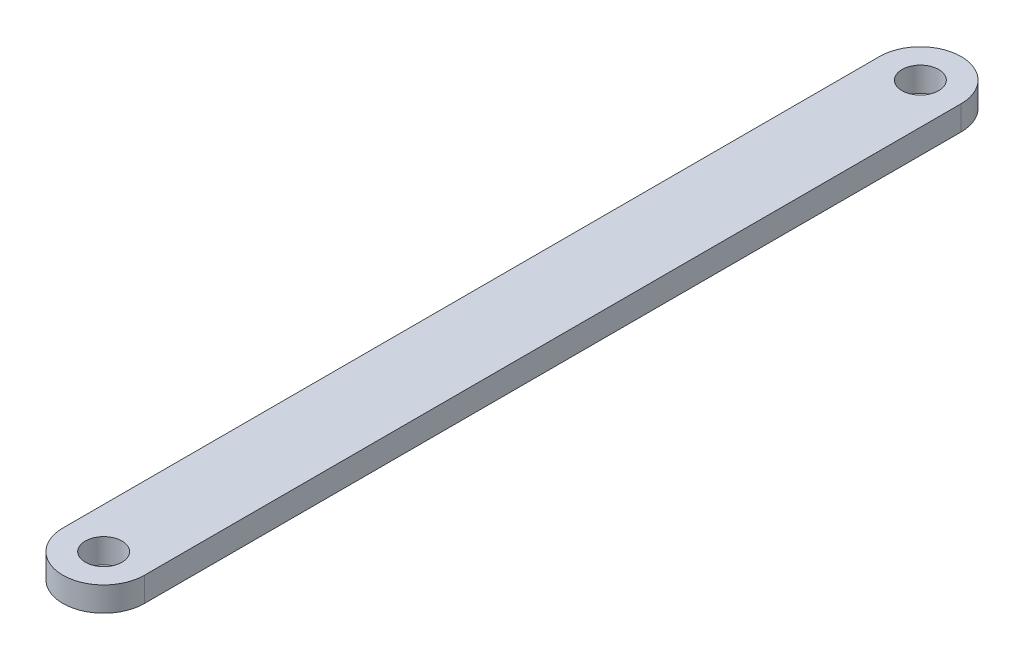
ISO-10303-21;
HEADER;
FILE_DESCRIPTION(('STEP AP214'),'2;1');
FILE_NAME('part.step','',(''),(''),'','','');
FILE_SCHEMA(('AUTOMOTIVE_DESIGN { 1 0 10303 214 1 1 1 1 }'));
ENDSEC;
DATA;
#1=APPLICATION_CONTEXT('core data for automotive mechanical design processes');
#2=APPLICATION_PROTOCOL_DEFINITION('international standard','automotive_design',2000,#1);
#3=PRODUCT_CONTEXT('',#1,'mechanical');
#4=PRODUCT('Part','Part','',(#3));
#5=PRODUCT_RELATED_PRODUCT_CATEGORY('part','',(#4));
#6=PRODUCT_DEFINITION_FORMATION('','',#4);
#7=PRODUCT_DEFINITION_CONTEXT('part definition',#1,'design');
#8=PRODUCT_DEFINITION('design','',#6,#7);
#9=PRODUCT_DEFINITION_SHAPE('','',#8);
#10=(LENGTH_UNIT() NAMED_UNIT(*) SI_UNIT(.MILLI.,.METRE.));
#11=(NAMED_UNIT(*) PLANE_ANGLE_UNIT() SI_UNIT($,.RADIAN.));
#12=(NAMED_UNIT(*) SI_UNIT($,.STERADIAN.) SOLID_ANGLE_UNIT());
#13=UNCERTAINTY_MEASURE_WITH_UNIT(LENGTH_MEASURE(1.E-05),#10,'distance_accuracy_value','');
#14=(GEOMETRIC_REPRESENTATION_CONTEXT(3) GLOBAL_UNCERTAINTY_ASSIGNED_CONTEXT((#13)) GLOBAL_UNIT_ASSIGNED_CONTEXT((#10,
#11,#12)) REPRESENTATION_CONTEXT('',''));
#15=CARTESIAN_POINT('',(0.,0.,0.));
#16=DIRECTION('',(0.,0.,1.));
#17=DIRECTION('',(1.,0.,0.));
#18=AXIS2_PLACEMENT_3D('',#15,#16,#17);
#19=CARTESIAN_POINT('',(0.,3.,0.));
#20=DIRECTION('',(0.,1.,0.));
#21=DIRECTION('',(0.,0.,1.));
#22=AXIS2_PLACEMENT_3D('',#19,#20,#21);
#23=PLANE('',#22);
#24=CARTESIAN_POINT('',(0.,3.,0.));
#25=DIRECTION('',(0.,1.,0.));
#26=DIRECTION('',(0.,0.,1.));
#27=AXIS2_PLACEMENT_3D('',#24,#25,#26);
#28=CIRCLE('',#27,2.25);
#29=CARTESIAN_POINT('',(0.,3.,2.25));
#30=VERTEX_POINT('',#29);
#31=EDGE_CURVE('E100',#30,#30,#28,.T.);
#32=ORIENTED_EDGE('',*,*,#31,.F.);
#33=EDGE_LOOP('',(#32));
#34=FACE_BOUND('',#33,.T.);
#35=CARTESIAN_POINT('',(0.,3.,0.));
#36=DIRECTION('',(0.,1.,0.));
#37=DIRECTION('',(0.,0.,1.));
#38=AXIS2_PLACEMENT_3D('',#35,#36,#37);
#39=CIRCLE('',#38,5.);
#40=CARTESIAN_POINT('',(5.,3.,0.));
#41=VERTEX_POINT('',#40);
#42=CARTESIAN_POINT('',(-5.,3.,0.));
#43=VERTEX_POINT('',#42);
#44=EDGE_CURVE('E85',#41,#43,#39,.T.);
#45=ORIENTED_EDGE('',*,*,#44,.T.);
#46=DIRECTION('',(0.,0.,1.));
#47=VECTOR('',#46,1.);
#48=CARTESIAN_POINT('',(-5.,3.,0.));
#49=LINE('',#48,#47);
#50=CARTESIAN_POINT('',(-4.99999999999999,3.,100.));
#51=VERTEX_POINT('',#50);
#52=EDGE_CURVE('E80',#43,#51,#49,.T.);
#53=ORIENTED_EDGE('',*,*,#52,.T.);
#54=CARTESIAN_POINT('',(0.,3.,100.));
#55=DIRECTION('',(0.,1.,0.));
#56=DIRECTION('',(0.,0.,1.));
#57=AXIS2_PLACEMENT_3D('',#54,#55,#56);
#58=CIRCLE('',#57,5.);
#59=CARTESIAN_POINT('',(5.00000000000001,3.,100.));
#60=VERTEX_POINT('',#59);
#61=EDGE_CURVE('E83',#51,#60,#58,.T.);
#62=ORIENTED_EDGE('',*,*,#61,.T.);
#63=DIRECTION('',(0.,0.,-1.));
#64=VECTOR('',#63,1.);
#65=CARTESIAN_POINT('',(5.,3.,0.));
#66=LINE('',#65,#64);
#67=EDGE_CURVE('E50',#60,#41,#66,.T.);
#68=ORIENTED_EDGE('',*,*,#67,.T.);
#69=EDGE_LOOP('',(#45,#53,#62,#68));
#70=FACE_BOUND('',#69,.T.);
#71=CARTESIAN_POINT('',(0.,3.,100.));
#72=DIRECTION('',(0.,1.,0.));
#73=DIRECTION('',(0.,0.,1.));
#74=AXIS2_PLACEMENT_3D('',#71,#72,#73);
#75=CIRCLE('',#74,2.25);
#76=CARTESIAN_POINT('',(0.,3.,102.25));
#77=VERTEX_POINT('',#76);
#78=EDGE_CURVE('E115',#77,#77,#75,.T.);
#79=ORIENTED_EDGE('',*,*,#78,.F.);
#80=EDGE_LOOP('',(#79));
#81=FACE_BOUND('',#80,.T.);
#82=ADVANCED_FACE('F33',(#34,#70,#81),#23,.T.);
#83=CARTESIAN_POINT('',(0.,0.,0.));
#84=DIRECTION('',(0.,1.,0.));
#85=DIRECTION('',(0.,0.,1.));
#86=AXIS2_PLACEMENT_3D('',#83,#84,#85);
#87=PLANE('',#86);
#88=CARTESIAN_POINT('',(0.,0.,0.));
#89=DIRECTION('',(0.,1.,0.));
#90=DIRECTION('',(0.,0.,1.));
#91=AXIS2_PLACEMENT_3D('',#88,#89,#90);
#92=CIRCLE('',#91,5.);
#93=CARTESIAN_POINT('',(5.,0.,0.));
#94=VERTEX_POINT('',#93);
#95=CARTESIAN_POINT('',(-5.,0.,0.));
#96=VERTEX_POINT('',#95);
#97=EDGE_CURVE('E97',#94,#96,#92,.T.);
#98=ORIENTED_EDGE('',*,*,#97,.F.);
#99=DIRECTION('',(0.,0.,-1.));
#100=VECTOR('',#99,1.);
#101=CARTESIAN_POINT('',(5.,0.,0.));
#102=LINE('',#101,#100);
#103=CARTESIAN_POINT('',(5.00000000000001,0.,100.));
#104=VERTEX_POINT('',#103);
#105=EDGE_CURVE('E73',#104,#94,#102,.T.);
#106=ORIENTED_EDGE('',*,*,#105,.F.);
#107=CARTESIAN_POINT('',(0.,0.,100.));
#108=DIRECTION('',(0.,1.,0.));
#109=DIRECTION('',(0.,0.,1.));
#110=AXIS2_PLACEMENT_3D('',#107,#108,#109);
#111=CIRCLE('',#110,5.);
#112=CARTESIAN_POINT('',(-4.99999999999999,0.,100.));
#113=VERTEX_POINT('',#112);
#114=EDGE_CURVE('E67',#113,#104,#111,.T.);
#115=ORIENTED_EDGE('',*,*,#114,.F.);
#116=DIRECTION('',(0.,0.,1.));
#117=VECTOR('',#116,1.);
#118=CARTESIAN_POINT('',(-5.,0.,0.));
#119=LINE('',#118,#117);
#120=EDGE_CURVE('E89',#96,#113,#119,.T.);
#121=ORIENTED_EDGE('',*,*,#120,.F.);
#122=EDGE_LOOP('',(#98,#106,#115,#121));
#123=FACE_BOUND('',#122,.T.);
#124=CARTESIAN_POINT('',(0.,0.,0.));
#125=DIRECTION('',(0.,1.,0.));
#126=DIRECTION('',(0.,0.,1.));
#127=AXIS2_PLACEMENT_3D('',#124,#125,#126);
#128=CIRCLE('',#127,2.25);
#129=CARTESIAN_POINT('',(0.,0.,2.25));
#130=VERTEX_POINT('',#129);
#131=EDGE_CURVE('E112',#130,#130,#128,.T.);
#132=ORIENTED_EDGE('',*,*,#131,.T.);
#133=EDGE_LOOP('',(#132));
#134=FACE_BOUND('',#133,.T.);
#135=CARTESIAN_POINT('',(0.,0.,100.));
#136=DIRECTION('',(0.,1.,0.));
#137=DIRECTION('',(0.,0.,1.));
#138=AXIS2_PLACEMENT_3D('',#135,#136,#137);
#139=CIRCLE('',#138,2.25);
#140=CARTESIAN_POINT('',(0.,0.,102.25));
#141=VERTEX_POINT('',#140);
#142=EDGE_CURVE('E118',#141,#141,#139,.T.);
#143=ORIENTED_EDGE('',*,*,#142,.T.);
#144=EDGE_LOOP('',(#143));
#145=FACE_BOUND('',#144,.T.);
#146=ADVANCED_FACE('F108',(#123,#134,#145),#87,.F.);
#147=CARTESIAN_POINT('',(0.,3.,0.));
#148=DIRECTION('',(0.,-1.,0.));
#149=DIRECTION('',(0.,0.,-1.));
#150=AXIS2_PLACEMENT_3D('',#147,#148,#149);
#151=CYLINDRICAL_SURFACE('',#150,5.);
#152=ORIENTED_EDGE('',*,*,#97,.T.);
#153=DIRECTION('',(0.,-1.,0.));
#154=VECTOR('',#153,1.);
#155=CARTESIAN_POINT('',(-5.,3.,0.));
#156=LINE('',#155,#154);
#157=EDGE_CURVE('E11',#43,#96,#156,.T.);
#158=ORIENTED_EDGE('',*,*,#157,.F.);
#159=ORIENTED_EDGE('',*,*,#44,.F.);
#160=DIRECTION('',(0.,-1.,0.));
#161=VECTOR('',#160,1.);
#162=CARTESIAN_POINT('',(5.,3.,0.));
#163=LINE('',#162,#161);
#164=EDGE_CURVE('E93',#41,#94,#163,.T.);
#165=ORIENTED_EDGE('',*,*,#164,.T.);
#166=EDGE_LOOP('',(#152,#158,#159,#165));
#167=FACE_BOUND('',#166,.T.);
#168=ADVANCED_FACE('F35',(#167),#151,.T.);
#169=CARTESIAN_POINT('',(-5.,3.,0.));
#170=DIRECTION('',(1.,0.,0.));
#171=DIRECTION('',(0.,0.,-1.));
#172=AXIS2_PLACEMENT_3D('',#169,#170,#171);
#173=PLANE('',#172);
#174=ORIENTED_EDGE('',*,*,#120,.T.);
#175=DIRECTION('',(0.,-1.,0.));
#176=VECTOR('',#175,1.);
#177=CARTESIAN_POINT('',(-4.99999999999999,3.,100.));
#178=LINE('',#177,#176);
#179=EDGE_CURVE('E42',#51,#113,#178,.T.);
#180=ORIENTED_EDGE('',*,*,#179,.F.);
#181=ORIENTED_EDGE('',*,*,#52,.F.);
#182=ORIENTED_EDGE('',*,*,#157,.T.);
#183=EDGE_LOOP('',(#174,#180,#181,#182));
#184=FACE_BOUND('',#183,.T.);
#185=ADVANCED_FACE('F88',(#184),#173,.F.);
#186=CARTESIAN_POINT('',(0.,3.,100.));
#187=DIRECTION('',(0.,-1.,0.));
#188=DIRECTION('',(0.,0.,-1.));
#189=AXIS2_PLACEMENT_3D('',#186,#187,#188);
#190=CYLINDRICAL_SURFACE('',#189,5.);
#191=ORIENTED_EDGE('',*,*,#114,.T.);
#192=DIRECTION('',(0.,-1.,0.));
#193=VECTOR('',#192,1.);
#194=CARTESIAN_POINT('',(5.00000000000001,3.,100.));
#195=LINE('',#194,#193);
#196=EDGE_CURVE('E90',#60,#104,#195,.T.);
#197=ORIENTED_EDGE('',*,*,#196,.F.);
#198=ORIENTED_EDGE('',*,*,#61,.F.);
#199=ORIENTED_EDGE('',*,*,#179,.T.);
#200=EDGE_LOOP('',(#191,#197,#198,#199));
#201=FACE_BOUND('',#200,.T.);
#202=ADVANCED_FACE('F91',(#201),#190,.T.);
#203=CARTESIAN_POINT('',(5.,3.,0.));
#204=DIRECTION('',(-1.,0.,0.));
#205=DIRECTION('',(0.,0.,1.));
#206=AXIS2_PLACEMENT_3D('',#203,#204,#205);
#207=PLANE('',#206);
#208=ORIENTED_EDGE('',*,*,#105,.T.);
#209=ORIENTED_EDGE('',*,*,#164,.F.);
#210=ORIENTED_EDGE('',*,*,#67,.F.);
#211=ORIENTED_EDGE('',*,*,#196,.T.);
#212=EDGE_LOOP('',(#208,#209,#210,#211));
#213=FACE_BOUND('',#212,.T.);
#214=ADVANCED_FACE('F105',(#213),#207,.F.);
#215=CARTESIAN_POINT('',(0.,3.,0.));
#216=DIRECTION('',(0.,-1.,0.));
#217=DIRECTION('',(0.,0.,-1.));
#218=AXIS2_PLACEMENT_3D('',#215,#216,#217);
#219=CYLINDRICAL_SURFACE('',#218,2.25);
#220=ORIENTED_EDGE('',*,*,#31,.T.);
#221=EDGE_LOOP('',(#220));
#222=FACE_BOUND('',#221,.T.);
#223=ORIENTED_EDGE('',*,*,#131,.F.);
#224=EDGE_LOOP('',(#223));
#225=FACE_BOUND('',#224,.T.);
#226=ADVANCED_FACE('F135',(#222,#225),#219,.F.);
#227=CARTESIAN_POINT('',(0.,3.,100.));
#228=DIRECTION('',(0.,-1.,0.));
#229=DIRECTION('',(0.,0.,-1.));
#230=AXIS2_PLACEMENT_3D('',#227,#228,#229);
#231=CYLINDRICAL_SURFACE('',#230,2.25);
#232=ORIENTED_EDGE('',*,*,#78,.T.);
#233=EDGE_LOOP('',(#232));
#234=FACE_BOUND('',#233,.T.);
#235=ORIENTED_EDGE('',*,*,#142,.F.);
#236=EDGE_LOOP('',(#235));
#237=FACE_BOUND('',#236,.T.);
#238=ADVANCED_FACE('F124',(#234,#237),#231,.F.);
#239=CLOSED_SHELL('',(#82,#146,#168,#185,#202,#214,#226,#238));
#240=MANIFOLD_SOLID_BREP('B2',#239);
#241=ADVANCED_BREP_SHAPE_REPRESENTATION('',(#18,#240),#14);
#242=SHAPE_DEFINITION_REPRESENTATION(#9,#241);
ENDSEC;
END-ISO-10303-21;
